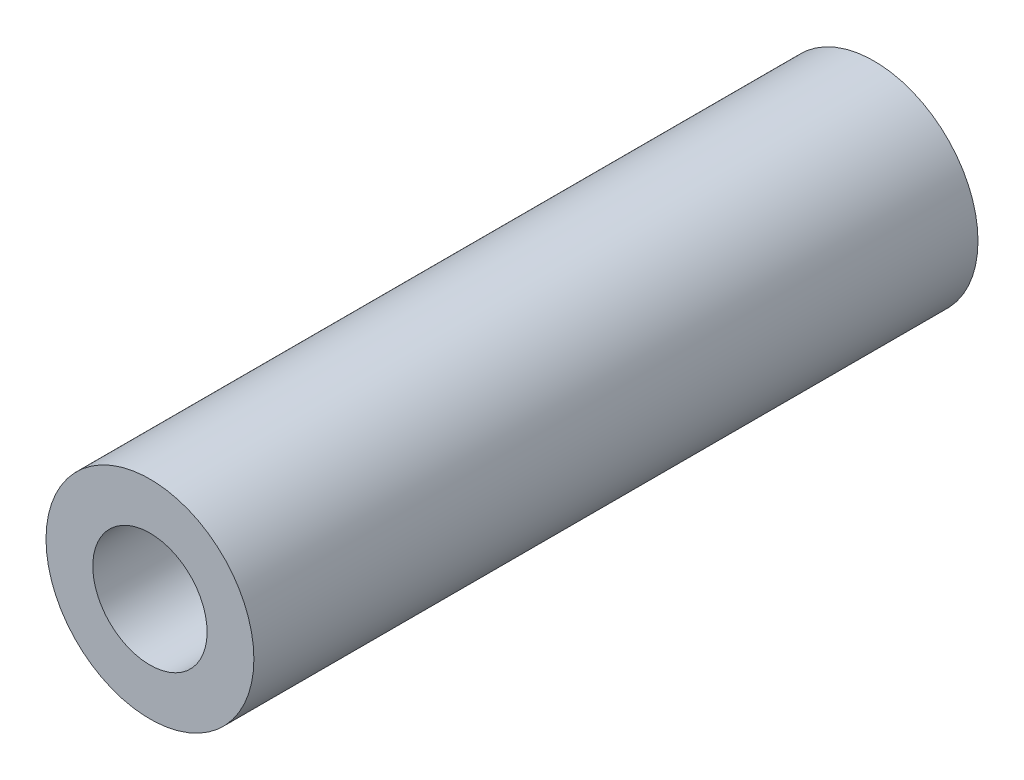
ISO-10303-21;
HEADER;
FILE_DESCRIPTION(('STEP AP214'),'2;1');
FILE_NAME('part.step','',(''),(''),'','','');
FILE_SCHEMA(('AUTOMOTIVE_DESIGN { 1 0 10303 214 1 1 1 1 }'));
ENDSEC;
DATA;
#1=APPLICATION_CONTEXT('core data for automotive mechanical design processes');
#2=APPLICATION_PROTOCOL_DEFINITION('international standard','automotive_design',2000,#1);
#3=PRODUCT_CONTEXT('',#1,'mechanical');
#4=PRODUCT('Part','Part','',(#3));
#5=PRODUCT_RELATED_PRODUCT_CATEGORY('part','',(#4));
#6=PRODUCT_DEFINITION_FORMATION('','',#4);
#7=PRODUCT_DEFINITION_CONTEXT('part definition',#1,'design');
#8=PRODUCT_DEFINITION('design','',#6,#7);
#9=PRODUCT_DEFINITION_SHAPE('','',#8);
#10=(LENGTH_UNIT() NAMED_UNIT(*) SI_UNIT(.MILLI.,.METRE.));
#11=(NAMED_UNIT(*) PLANE_ANGLE_UNIT() SI_UNIT($,.RADIAN.));
#12=(NAMED_UNIT(*) SI_UNIT($,.STERADIAN.) SOLID_ANGLE_UNIT());
#13=UNCERTAINTY_MEASURE_WITH_UNIT(LENGTH_MEASURE(1.E-05),#10,'distance_accuracy_value','');
#14=(GEOMETRIC_REPRESENTATION_CONTEXT(3) GLOBAL_UNCERTAINTY_ASSIGNED_CONTEXT((#13)) GLOBAL_UNIT_ASSIGNED_CONTEXT((#10,
#11,#12)) REPRESENTATION_CONTEXT('',''));
#15=CARTESIAN_POINT('',(0.,0.,0.));
#16=DIRECTION('',(0.,0.,1.));
#17=DIRECTION('',(1.,0.,0.));
#18=AXIS2_PLACEMENT_3D('',#15,#16,#17);
#19=CARTESIAN_POINT('',(0.,0.,41.8));
#20=DIRECTION('',(0.,0.,-1.));
#21=DIRECTION('',(-1.,0.,0.));
#22=AXIS2_PLACEMENT_3D('',#19,#20,#21);
#23=CYLINDRICAL_SURFACE('',#22,6.);
#24=CARTESIAN_POINT('',(0.,0.,41.8));
#25=DIRECTION('',(0.,0.,1.));
#26=DIRECTION('',(1.,0.,0.));
#27=AXIS2_PLACEMENT_3D('',#24,#25,#26);
#28=CIRCLE('',#27,6.);
#29=CARTESIAN_POINT('',(6.,0.,41.8));
#30=VERTEX_POINT('',#29);
#31=EDGE_CURVE('E10',#30,#30,#28,.T.);
#32=ORIENTED_EDGE('',*,*,#31,.F.);
#33=EDGE_LOOP('',(#32));
#34=FACE_BOUND('',#33,.T.);
#35=CARTESIAN_POINT('',(0.,0.,0.));
#36=DIRECTION('',(0.,0.,1.));
#37=DIRECTION('',(1.,0.,0.));
#38=AXIS2_PLACEMENT_3D('',#35,#36,#37);
#39=CIRCLE('',#38,6.);
#40=CARTESIAN_POINT('',(6.,0.,0.));
#41=VERTEX_POINT('',#40);
#42=EDGE_CURVE('E44',#41,#41,#39,.T.);
#43=ORIENTED_EDGE('',*,*,#42,.T.);
#44=EDGE_LOOP('',(#43));
#45=FACE_BOUND('',#44,.T.);
#46=ADVANCED_FACE('F41',(#34,#45),#23,.T.);
#47=CARTESIAN_POINT('',(0.,0.,41.8));
#48=DIRECTION('',(0.,0.,1.));
#49=DIRECTION('',(1.,0.,0.));
#50=AXIS2_PLACEMENT_3D('',#47,#48,#49);
#51=PLANE('',#50);
#52=CARTESIAN_POINT('',(0.,0.,41.8));
#53=DIRECTION('',(0.,0.,1.));
#54=DIRECTION('',(1.,0.,0.));
#55=AXIS2_PLACEMENT_3D('',#52,#53,#54);
#56=CIRCLE('',#55,3.3);
#57=CARTESIAN_POINT('',(3.3,0.,41.8));
#58=VERTEX_POINT('',#57);
#59=EDGE_CURVE('E58',#58,#58,#56,.T.);
#60=ORIENTED_EDGE('',*,*,#59,.F.);
#61=EDGE_LOOP('',(#60));
#62=FACE_BOUND('',#61,.T.);
#63=ORIENTED_EDGE('',*,*,#31,.T.);
#64=EDGE_LOOP('',(#63));
#65=FACE_BOUND('',#64,.T.);
#66=ADVANCED_FACE('F65',(#62,#65),#51,.T.);
#67=CARTESIAN_POINT('',(0.,0.,0.));
#68=DIRECTION('',(0.,0.,1.));
#69=DIRECTION('',(1.,0.,0.));
#70=AXIS2_PLACEMENT_3D('',#67,#68,#69);
#71=PLANE('',#70);
#72=CARTESIAN_POINT('',(0.,0.,0.));
#73=DIRECTION('',(0.,0.,1.));
#74=DIRECTION('',(1.,0.,0.));
#75=AXIS2_PLACEMENT_3D('',#72,#73,#74);
#76=CIRCLE('',#75,3.29999999999999);
#77=CARTESIAN_POINT('',(3.29999999999999,0.,0.));
#78=VERTEX_POINT('',#77);
#79=EDGE_CURVE('E53',#78,#78,#76,.T.);
#80=ORIENTED_EDGE('',*,*,#79,.T.);
#81=EDGE_LOOP('',(#80));
#82=FACE_BOUND('',#81,.T.);
#83=ORIENTED_EDGE('',*,*,#42,.F.);
#84=EDGE_LOOP('',(#83));
#85=FACE_BOUND('',#84,.T.);
#86=ADVANCED_FACE('F67',(#82,#85),#71,.F.);
#87=CARTESIAN_POINT('',(0.,0.,41.8));
#88=DIRECTION('',(0.,0.,1.));
#89=DIRECTION('',(1.,0.,0.));
#90=AXIS2_PLACEMENT_3D('',#87,#88,#89);
#91=CYLINDRICAL_SURFACE('',#90,3.29999999999999);
#92=ORIENTED_EDGE('',*,*,#79,.F.);
#93=EDGE_LOOP('',(#92));
#94=FACE_BOUND('',#93,.T.);
#95=ORIENTED_EDGE('',*,*,#59,.T.);
#96=EDGE_LOOP('',(#95));
#97=FACE_BOUND('',#96,.T.);
#98=ADVANCED_FACE('F63',(#94,#97),#91,.F.);
#99=CLOSED_SHELL('',(#46,#66,#86,#98));
#100=MANIFOLD_SOLID_BREP('B2',#99);
#101=ADVANCED_BREP_SHAPE_REPRESENTATION('',(#18,#100),#14);
#102=SHAPE_DEFINITION_REPRESENTATION(#9,#101);
ENDSEC;
END-ISO-10303-21;
